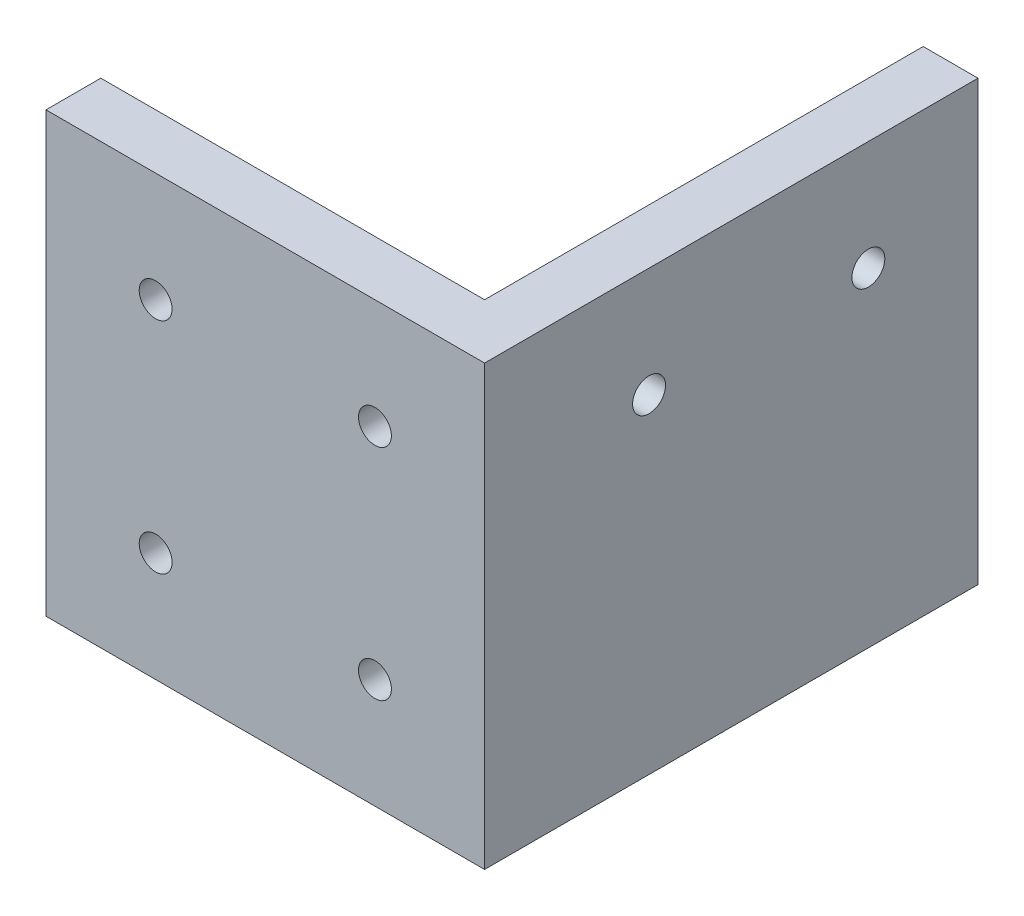
ISO-10303-21;
HEADER;
FILE_DESCRIPTION(('STEP AP214'),'2;1');
FILE_NAME('part.step','',(''),(''),'','','');
FILE_SCHEMA(('AUTOMOTIVE_DESIGN { 1 0 10303 214 1 1 1 1 }'));
ENDSEC;
DATA;
#1=APPLICATION_CONTEXT('core data for automotive mechanical design processes');
#2=APPLICATION_PROTOCOL_DEFINITION('international standard','automotive_design',2000,#1);
#3=PRODUCT_CONTEXT('',#1,'mechanical');
#4=PRODUCT('Part','Part','',(#3));
#5=PRODUCT_RELATED_PRODUCT_CATEGORY('part','',(#4));
#6=PRODUCT_DEFINITION_FORMATION('','',#4);
#7=PRODUCT_DEFINITION_CONTEXT('part definition',#1,'design');
#8=PRODUCT_DEFINITION('design','',#6,#7);
#9=PRODUCT_DEFINITION_SHAPE('','',#8);
#10=(LENGTH_UNIT() NAMED_UNIT(*) SI_UNIT(.MILLI.,.METRE.));
#11=(NAMED_UNIT(*) PLANE_ANGLE_UNIT() SI_UNIT($,.RADIAN.));
#12=(NAMED_UNIT(*) SI_UNIT($,.STERADIAN.) SOLID_ANGLE_UNIT());
#13=UNCERTAINTY_MEASURE_WITH_UNIT(LENGTH_MEASURE(1.E-05),#10,'distance_accuracy_value','');
#14=(GEOMETRIC_REPRESENTATION_CONTEXT(3) GLOBAL_UNCERTAINTY_ASSIGNED_CONTEXT((#13)) GLOBAL_UNIT_ASSIGNED_CONTEXT((#10,
#11,#12)) REPRESENTATION_CONTEXT('',''));
#15=CARTESIAN_POINT('',(0.,0.,0.));
#16=DIRECTION('',(0.,0.,1.));
#17=DIRECTION('',(1.,0.,0.));
#18=AXIS2_PLACEMENT_3D('',#15,#16,#17);
#19=CARTESIAN_POINT('',(0.,85.,-7.));
#20=DIRECTION('',(-1.,0.,0.));
#21=DIRECTION('',(0.,0.,1.));
#22=AXIS2_PLACEMENT_3D('',#19,#20,#21);
#23=CYLINDRICAL_SURFACE('',#22,1.5);
#24=CARTESIAN_POINT('',(0.,85.,-7.));
#25=DIRECTION('',(-1.,0.,0.));
#26=DIRECTION('',(0.,0.,1.));
#27=AXIS2_PLACEMENT_3D('',#24,#25,#26);
#28=CIRCLE('',#27,1.5);
#29=CARTESIAN_POINT('',(0.,85.,-5.5));
#30=VERTEX_POINT('',#29);
#31=EDGE_CURVE('E115',#30,#30,#28,.T.);
#32=ORIENTED_EDGE('',*,*,#31,.F.);
#33=EDGE_LOOP('',(#32));
#34=FACE_BOUND('',#33,.T.);
#35=CARTESIAN_POINT('',(-3.5,85.,-7.));
#36=DIRECTION('',(-1.,0.,0.));
#37=DIRECTION('',(0.,0.,1.));
#38=AXIS2_PLACEMENT_3D('',#35,#36,#37);
#39=CIRCLE('',#38,1.5);
#40=CARTESIAN_POINT('',(-3.5,85.,-5.5));
#41=VERTEX_POINT('',#40);
#42=EDGE_CURVE('E49',#41,#41,#39,.F.);
#43=ORIENTED_EDGE('',*,*,#42,.F.);
#44=EDGE_LOOP('',(#43));
#45=FACE_BOUND('',#44,.T.);
#46=ADVANCED_FACE('F45',(#34,#45),#23,.F.);
#47=CARTESIAN_POINT('',(0.,85.,-27.));
#48=DIRECTION('',(-1.,0.,0.));
#49=DIRECTION('',(0.,0.,1.));
#50=AXIS2_PLACEMENT_3D('',#47,#48,#49);
#51=CYLINDRICAL_SURFACE('',#50,1.5);
#52=CARTESIAN_POINT('',(0.,85.,-27.));
#53=DIRECTION('',(-1.,0.,0.));
#54=DIRECTION('',(0.,0.,1.));
#55=AXIS2_PLACEMENT_3D('',#52,#53,#54);
#56=CIRCLE('',#55,1.5);
#57=CARTESIAN_POINT('',(0.,85.,-25.5));
#58=VERTEX_POINT('',#57);
#59=EDGE_CURVE('E169',#58,#58,#56,.T.);
#60=ORIENTED_EDGE('',*,*,#59,.F.);
#61=EDGE_LOOP('',(#60));
#62=FACE_BOUND('',#61,.T.);
#63=CARTESIAN_POINT('',(-3.5,85.,-27.));
#64=DIRECTION('',(-1.,0.,0.));
#65=DIRECTION('',(0.,0.,1.));
#66=AXIS2_PLACEMENT_3D('',#63,#64,#65);
#67=CIRCLE('',#66,1.5);
#68=CARTESIAN_POINT('',(-3.5,85.,-25.5));
#69=VERTEX_POINT('',#68);
#70=EDGE_CURVE('E163',#69,#69,#67,.F.);
#71=ORIENTED_EDGE('',*,*,#70,.F.);
#72=EDGE_LOOP('',(#71));
#73=FACE_BOUND('',#72,.T.);
#74=ADVANCED_FACE('F224',(#62,#73),#51,.F.);
#75=CARTESIAN_POINT('',(-10.,85.,597.1));
#76=DIRECTION('',(0.,0.,-1.));
#77=DIRECTION('',(0.,1.,0.));
#78=AXIS2_PLACEMENT_3D('',#75,#76,#77);
#79=CYLINDRICAL_SURFACE('',#78,1.5);
#80=CARTESIAN_POINT('',(-10.,85.,3.));
#81=DIRECTION('',(0.,0.,-1.));
#82=DIRECTION('',(0.,1.,0.));
#83=AXIS2_PLACEMENT_3D('',#80,#81,#82);
#84=CIRCLE('',#83,1.5);
#85=CARTESIAN_POINT('',(-10.,86.5,3.));
#86=VERTEX_POINT('',#85);
#87=EDGE_CURVE('E134',#86,#86,#84,.T.);
#88=ORIENTED_EDGE('',*,*,#87,.T.);
#89=EDGE_LOOP('',(#88));
#90=FACE_BOUND('',#89,.T.);
#91=CARTESIAN_POINT('',(-10.,85.,8.00000000000001));
#92=DIRECTION('',(0.,0.,-1.));
#93=DIRECTION('',(0.,1.,0.));
#94=AXIS2_PLACEMENT_3D('',#91,#92,#93);
#95=CIRCLE('',#94,1.5);
#96=CARTESIAN_POINT('',(-10.,86.5,8.00000000000001));
#97=VERTEX_POINT('',#96);
#98=EDGE_CURVE('E139',#97,#97,#95,.T.);
#99=ORIENTED_EDGE('',*,*,#98,.F.);
#100=EDGE_LOOP('',(#99));
#101=FACE_BOUND('',#100,.T.);
#102=ADVANCED_FACE('F231',(#90,#101),#79,.F.);
#103=CARTESIAN_POINT('',(-30.,85.,597.1));
#104=DIRECTION('',(0.,0.,-1.));
#105=DIRECTION('',(0.,1.,0.));
#106=AXIS2_PLACEMENT_3D('',#103,#104,#105);
#107=CYLINDRICAL_SURFACE('',#106,1.5);
#108=CARTESIAN_POINT('',(-30.,85.,3.));
#109=DIRECTION('',(0.,0.,-1.));
#110=DIRECTION('',(0.,1.,0.));
#111=AXIS2_PLACEMENT_3D('',#108,#109,#110);
#112=CIRCLE('',#111,1.5);
#113=CARTESIAN_POINT('',(-30.,86.5,3.));
#114=VERTEX_POINT('',#113);
#115=EDGE_CURVE('E131',#114,#114,#112,.T.);
#116=ORIENTED_EDGE('',*,*,#115,.T.);
#117=EDGE_LOOP('',(#116));
#118=FACE_BOUND('',#117,.T.);
#119=CARTESIAN_POINT('',(-30.,85.,8.00000000000001));
#120=DIRECTION('',(0.,0.,-1.));
#121=DIRECTION('',(0.,1.,0.));
#122=AXIS2_PLACEMENT_3D('',#119,#120,#121);
#123=CIRCLE('',#122,1.5);
#124=CARTESIAN_POINT('',(-30.,86.5,8.00000000000001));
#125=VERTEX_POINT('',#124);
#126=EDGE_CURVE('E142',#125,#125,#123,.T.);
#127=ORIENTED_EDGE('',*,*,#126,.F.);
#128=EDGE_LOOP('',(#127));
#129=FACE_BOUND('',#128,.T.);
#130=ADVANCED_FACE('F246',(#118,#129),#107,.F.);
#131=CARTESIAN_POINT('',(-30.,65.,597.1));
#132=DIRECTION('',(0.,0.,-1.));
#133=DIRECTION('',(0.,1.,0.));
#134=AXIS2_PLACEMENT_3D('',#131,#132,#133);
#135=CYLINDRICAL_SURFACE('',#134,1.50000000000001);
#136=CARTESIAN_POINT('',(-30.,65.,3.));
#137=DIRECTION('',(0.,0.,-1.));
#138=DIRECTION('',(0.,1.,0.));
#139=AXIS2_PLACEMENT_3D('',#136,#137,#138);
#140=CIRCLE('',#139,1.50000000000001);
#141=CARTESIAN_POINT('',(-30.,66.5,3.));
#142=VERTEX_POINT('',#141);
#143=EDGE_CURVE('E125',#142,#142,#140,.T.);
#144=ORIENTED_EDGE('',*,*,#143,.T.);
#145=EDGE_LOOP('',(#144));
#146=FACE_BOUND('',#145,.T.);
#147=CARTESIAN_POINT('',(-30.,65.,8.00000000000001));
#148=DIRECTION('',(0.,0.,-1.));
#149=DIRECTION('',(0.,1.,0.));
#150=AXIS2_PLACEMENT_3D('',#147,#148,#149);
#151=CIRCLE('',#150,1.50000000000001);
#152=CARTESIAN_POINT('',(-30.,66.5,8.00000000000001));
#153=VERTEX_POINT('',#152);
#154=EDGE_CURVE('E145',#153,#153,#151,.T.);
#155=ORIENTED_EDGE('',*,*,#154,.F.);
#156=EDGE_LOOP('',(#155));
#157=FACE_BOUND('',#156,.T.);
#158=ADVANCED_FACE('F219',(#146,#157),#135,.F.);
#159=CARTESIAN_POINT('',(-10.,65.,597.1));
#160=DIRECTION('',(0.,0.,-1.));
#161=DIRECTION('',(0.,1.,0.));
#162=AXIS2_PLACEMENT_3D('',#159,#160,#161);
#163=CYLINDRICAL_SURFACE('',#162,1.5);
#164=CARTESIAN_POINT('',(-10.,65.,3.));
#165=DIRECTION('',(0.,0.,-1.));
#166=DIRECTION('',(0.,1.,0.));
#167=AXIS2_PLACEMENT_3D('',#164,#165,#166);
#168=CIRCLE('',#167,1.5);
#169=CARTESIAN_POINT('',(-10.,66.5,3.));
#170=VERTEX_POINT('',#169);
#171=EDGE_CURVE('E121',#170,#170,#168,.T.);
#172=ORIENTED_EDGE('',*,*,#171,.T.);
#173=EDGE_LOOP('',(#172));
#174=FACE_BOUND('',#173,.T.);
#175=CARTESIAN_POINT('',(-10.,65.,8.00000000000001));
#176=DIRECTION('',(0.,0.,-1.));
#177=DIRECTION('',(0.,1.,0.));
#178=AXIS2_PLACEMENT_3D('',#175,#176,#177);
#179=CIRCLE('',#178,1.5);
#180=CARTESIAN_POINT('',(-10.,66.5,8.00000000000001));
#181=VERTEX_POINT('',#180);
#182=EDGE_CURVE('E148',#181,#181,#179,.T.);
#183=ORIENTED_EDGE('',*,*,#182,.F.);
#184=EDGE_LOOP('',(#183));
#185=FACE_BOUND('',#184,.T.);
#186=ADVANCED_FACE('F211',(#174,#185),#163,.F.);
#187=CARTESIAN_POINT('',(-40.,0.,0.));
#188=DIRECTION('',(-1.,0.,0.));
#189=DIRECTION('',(0.,0.,1.));
#190=AXIS2_PLACEMENT_3D('',#187,#188,#189);
#191=PLANE('',#190);
#192=DIRECTION('',(0.,-1.,0.));
#193=VECTOR('',#192,1.);
#194=CARTESIAN_POINT('',(-40.,95.,3.));
#195=LINE('',#194,#193);
#196=CARTESIAN_POINT('',(-40.,95.,3.));
#197=VERTEX_POINT('',#196);
#198=CARTESIAN_POINT('',(-40.,55.,3.));
#199=VERTEX_POINT('',#198);
#200=EDGE_CURVE('E152',#197,#199,#195,.T.);
#201=ORIENTED_EDGE('',*,*,#200,.T.);
#202=DIRECTION('',(0.,0.,1.));
#203=VECTOR('',#202,1.);
#204=CARTESIAN_POINT('',(-40.,55.,3.));
#205=LINE('',#204,#203);
#206=CARTESIAN_POINT('',(-40.,55.,8.00000000000001));
#207=VERTEX_POINT('',#206);
#208=EDGE_CURVE('E155',#199,#207,#205,.T.);
#209=ORIENTED_EDGE('',*,*,#208,.T.);
#210=DIRECTION('',(0.,1.,0.));
#211=VECTOR('',#210,1.);
#212=CARTESIAN_POINT('',(-40.,95.,8.));
#213=LINE('',#212,#211);
#214=CARTESIAN_POINT('',(-40.,95.,8.));
#215=VERTEX_POINT('',#214);
#216=EDGE_CURVE('E157',#207,#215,#213,.T.);
#217=ORIENTED_EDGE('',*,*,#216,.T.);
#218=DIRECTION('',(0.,0.,-1.));
#219=VECTOR('',#218,1.);
#220=CARTESIAN_POINT('',(-40.,95.,3.));
#221=LINE('',#220,#219);
#222=EDGE_CURVE('E107',#215,#197,#221,.T.);
#223=ORIENTED_EDGE('',*,*,#222,.T.);
#224=EDGE_LOOP('',(#201,#209,#217,#223));
#225=FACE_BOUND('',#224,.T.);
#226=ADVANCED_FACE('F209',(#225),#191,.T.);
#227=CARTESIAN_POINT('',(-40.,95.,8.));
#228=DIRECTION('',(0.,0.,-1.));
#229=DIRECTION('',(0.,1.,0.));
#230=AXIS2_PLACEMENT_3D('',#227,#228,#229);
#231=PLANE('',#230);
#232=ORIENTED_EDGE('',*,*,#182,.T.);
#233=EDGE_LOOP('',(#232));
#234=FACE_BOUND('',#233,.T.);
#235=ORIENTED_EDGE('',*,*,#154,.T.);
#236=EDGE_LOOP('',(#235));
#237=FACE_BOUND('',#236,.T.);
#238=ORIENTED_EDGE('',*,*,#126,.T.);
#239=EDGE_LOOP('',(#238));
#240=FACE_BOUND('',#239,.T.);
#241=ORIENTED_EDGE('',*,*,#98,.T.);
#242=EDGE_LOOP('',(#241));
#243=FACE_BOUND('',#242,.T.);
#244=DIRECTION('',(1.,0.,0.));
#245=VECTOR('',#244,1.);
#246=CARTESIAN_POINT('',(-40.,55.,8.00000000000001));
#247=LINE('',#246,#245);
#248=CARTESIAN_POINT('',(0.,55.,8.00000000000001));
#249=VERTEX_POINT('',#248);
#250=EDGE_CURVE('E54',#207,#249,#247,.T.);
#251=ORIENTED_EDGE('',*,*,#250,.T.);
#252=DIRECTION('',(0.,-1.,0.));
#253=VECTOR('',#252,1.);
#254=CARTESIAN_POINT('',(0.,95.,8.));
#255=LINE('',#254,#253);
#256=CARTESIAN_POINT('',(0.,95.,8.));
#257=VERTEX_POINT('',#256);
#258=EDGE_CURVE('E110',#257,#249,#255,.T.);
#259=ORIENTED_EDGE('',*,*,#258,.F.);
#260=DIRECTION('',(1.,0.,0.));
#261=VECTOR('',#260,1.);
#262=CARTESIAN_POINT('',(-40.,95.,8.));
#263=LINE('',#262,#261);
#264=EDGE_CURVE('E102',#215,#257,#263,.T.);
#265=ORIENTED_EDGE('',*,*,#264,.F.);
#266=ORIENTED_EDGE('',*,*,#216,.F.);
#267=EDGE_LOOP('',(#251,#259,#265,#266));
#268=FACE_BOUND('',#267,.T.);
#269=ADVANCED_FACE('F111',(#234,#237,#240,#243,#268),#231,.F.);
#270=CARTESIAN_POINT('',(-40.,55.,3.));
#271=DIRECTION('',(0.,1.,0.));
#272=DIRECTION('',(0.,0.,1.));
#273=AXIS2_PLACEMENT_3D('',#270,#271,#272);
#274=PLANE('',#273);
#275=DIRECTION('',(0.,0.,1.));
#276=VECTOR('',#275,1.);
#277=CARTESIAN_POINT('',(0.,55.,3.));
#278=LINE('',#277,#276);
#279=CARTESIAN_POINT('',(0.,55.,-37.));
#280=VERTEX_POINT('',#279);
#281=EDGE_CURVE('E151',#280,#249,#278,.T.);
#282=ORIENTED_EDGE('',*,*,#281,.T.);
#283=ORIENTED_EDGE('',*,*,#250,.F.);
#284=ORIENTED_EDGE('',*,*,#208,.F.);
#285=DIRECTION('',(1.,0.,0.));
#286=VECTOR('',#285,1.);
#287=CARTESIAN_POINT('',(-40.,55.,3.));
#288=LINE('',#287,#286);
#289=CARTESIAN_POINT('',(-5.,55.,3.));
#290=VERTEX_POINT('',#289);
#291=EDGE_CURVE('E11',#199,#290,#288,.T.);
#292=ORIENTED_EDGE('',*,*,#291,.T.);
#293=DIRECTION('',(0.,0.,-1.));
#294=VECTOR('',#293,1.);
#295=CARTESIAN_POINT('',(-5.,55.,3.));
#296=LINE('',#295,#294);
#297=CARTESIAN_POINT('',(-5.,55.,-37.));
#298=VERTEX_POINT('',#297);
#299=EDGE_CURVE('E69',#290,#298,#296,.T.);
#300=ORIENTED_EDGE('',*,*,#299,.T.);
#301=DIRECTION('',(1.,0.,0.));
#302=VECTOR('',#301,1.);
#303=CARTESIAN_POINT('',(-5.,55.,-37.));
#304=LINE('',#303,#302);
#305=EDGE_CURVE('E127',#298,#280,#304,.T.);
#306=ORIENTED_EDGE('',*,*,#305,.T.);
#307=EDGE_LOOP('',(#282,#283,#284,#292,#300,#306));
#308=FACE_BOUND('',#307,.T.);
#309=ADVANCED_FACE('F200',(#308),#274,.F.);
#310=CARTESIAN_POINT('',(-40.,95.,3.));
#311=DIRECTION('',(0.,0.,1.));
#312=DIRECTION('',(0.,-1.,0.));
#313=AXIS2_PLACEMENT_3D('',#310,#311,#312);
#314=PLANE('',#313);
#315=ORIENTED_EDGE('',*,*,#171,.F.);
#316=EDGE_LOOP('',(#315));
#317=FACE_BOUND('',#316,.T.);
#318=ORIENTED_EDGE('',*,*,#143,.F.);
#319=EDGE_LOOP('',(#318));
#320=FACE_BOUND('',#319,.T.);
#321=ORIENTED_EDGE('',*,*,#115,.F.);
#322=EDGE_LOOP('',(#321));
#323=FACE_BOUND('',#322,.T.);
#324=ORIENTED_EDGE('',*,*,#87,.F.);
#325=EDGE_LOOP('',(#324));
#326=FACE_BOUND('',#325,.T.);
#327=DIRECTION('',(1.,0.,0.));
#328=VECTOR('',#327,1.);
#329=CARTESIAN_POINT('',(-40.,95.,3.));
#330=LINE('',#329,#328);
#331=CARTESIAN_POINT('',(-5.,95.,3.));
#332=VERTEX_POINT('',#331);
#333=EDGE_CURVE('E108',#197,#332,#330,.T.);
#334=ORIENTED_EDGE('',*,*,#333,.T.);
#335=DIRECTION('',(0.,-1.,0.));
#336=VECTOR('',#335,1.);
#337=CARTESIAN_POINT('',(-5.,95.,3.));
#338=LINE('',#337,#336);
#339=EDGE_CURVE('E188',#332,#290,#338,.T.);
#340=ORIENTED_EDGE('',*,*,#339,.T.);
#341=ORIENTED_EDGE('',*,*,#291,.F.);
#342=ORIENTED_EDGE('',*,*,#200,.F.);
#343=EDGE_LOOP('',(#334,#340,#341,#342));
#344=FACE_BOUND('',#343,.T.);
#345=ADVANCED_FACE('F206',(#317,#320,#323,#326,#344),#314,.F.);
#346=CARTESIAN_POINT('',(0.,95.,597.1));
#347=DIRECTION('',(0.,1.,0.));
#348=DIRECTION('',(0.,0.,1.));
#349=AXIS2_PLACEMENT_3D('',#346,#347,#348);
#350=PLANE('',#349);
#351=ORIENTED_EDGE('',*,*,#264,.T.);
#352=DIRECTION('',(0.,0.,-1.));
#353=VECTOR('',#352,1.);
#354=CARTESIAN_POINT('',(0.,95.,597.1));
#355=LINE('',#354,#353);
#356=CARTESIAN_POINT('',(0.,95.,-37.));
#357=VERTEX_POINT('',#356);
#358=EDGE_CURVE('E104',#257,#357,#355,.T.);
#359=ORIENTED_EDGE('',*,*,#358,.T.);
#360=DIRECTION('',(1.,0.,0.));
#361=VECTOR('',#360,1.);
#362=CARTESIAN_POINT('',(-5.,95.,-37.));
#363=LINE('',#362,#361);
#364=CARTESIAN_POINT('',(-5.,95.,-37.));
#365=VERTEX_POINT('',#364);
#366=EDGE_CURVE('E122',#365,#357,#363,.T.);
#367=ORIENTED_EDGE('',*,*,#366,.F.);
#368=DIRECTION('',(0.,0.,1.));
#369=VECTOR('',#368,1.);
#370=CARTESIAN_POINT('',(-5.,95.,3.));
#371=LINE('',#370,#369);
#372=EDGE_CURVE('E194',#365,#332,#371,.T.);
#373=ORIENTED_EDGE('',*,*,#372,.T.);
#374=ORIENTED_EDGE('',*,*,#333,.F.);
#375=ORIENTED_EDGE('',*,*,#222,.F.);
#376=EDGE_LOOP('',(#351,#359,#367,#373,#374,#375));
#377=FACE_BOUND('',#376,.T.);
#378=ADVANCED_FACE('F47',(#377),#350,.T.);
#379=CARTESIAN_POINT('',(0.,95.,597.1));
#380=DIRECTION('',(-1.,0.,0.));
#381=DIRECTION('',(0.,0.,1.));
#382=AXIS2_PLACEMENT_3D('',#379,#380,#381);
#383=PLANE('',#382);
#384=ORIENTED_EDGE('',*,*,#358,.F.);
#385=ORIENTED_EDGE('',*,*,#258,.T.);
#386=ORIENTED_EDGE('',*,*,#281,.F.);
#387=DIRECTION('',(0.,1.,0.));
#388=VECTOR('',#387,1.);
#389=CARTESIAN_POINT('',(0.,95.,-37.));
#390=LINE('',#389,#388);
#391=EDGE_CURVE('E114',#280,#357,#390,.T.);
#392=ORIENTED_EDGE('',*,*,#391,.T.);
#393=EDGE_LOOP('',(#384,#385,#386,#392));
#394=FACE_BOUND('',#393,.T.);
#395=ORIENTED_EDGE('',*,*,#31,.T.);
#396=EDGE_LOOP('',(#395));
#397=FACE_BOUND('',#396,.T.);
#398=ORIENTED_EDGE('',*,*,#59,.T.);
#399=EDGE_LOOP('',(#398));
#400=FACE_BOUND('',#399,.T.);
#401=ADVANCED_FACE('F118',(#394,#397,#400),#383,.F.);
#402=CARTESIAN_POINT('',(-5.,95.,-37.));
#403=DIRECTION('',(0.,0.,-1.));
#404=DIRECTION('',(0.,1.,0.));
#405=AXIS2_PLACEMENT_3D('',#402,#403,#404);
#406=PLANE('',#405);
#407=ORIENTED_EDGE('',*,*,#391,.F.);
#408=ORIENTED_EDGE('',*,*,#305,.F.);
#409=DIRECTION('',(0.,1.,0.));
#410=VECTOR('',#409,1.);
#411=CARTESIAN_POINT('',(-5.,95.,-37.));
#412=LINE('',#411,#410);
#413=EDGE_CURVE('E191',#298,#365,#412,.T.);
#414=ORIENTED_EDGE('',*,*,#413,.T.);
#415=ORIENTED_EDGE('',*,*,#366,.T.);
#416=EDGE_LOOP('',(#407,#408,#414,#415));
#417=FACE_BOUND('',#416,.T.);
#418=ADVANCED_FACE('F202',(#417),#406,.T.);
#419=CARTESIAN_POINT('',(-5.,0.,0.));
#420=DIRECTION('',(1.,0.,0.));
#421=DIRECTION('',(0.,0.,-1.));
#422=AXIS2_PLACEMENT_3D('',#419,#420,#421);
#423=PLANE('',#422);
#424=CARTESIAN_POINT('',(-5.,85.,-27.));
#425=DIRECTION('',(-1.,0.,0.));
#426=DIRECTION('',(0.,0.,1.));
#427=AXIS2_PLACEMENT_3D('',#424,#425,#426);
#428=CIRCLE('',#427,3.5);
#429=CARTESIAN_POINT('',(-5.,85.,-23.5));
#430=VERTEX_POINT('',#429);
#431=EDGE_CURVE('E171',#430,#430,#428,.T.);
#432=ORIENTED_EDGE('',*,*,#431,.F.);
#433=EDGE_LOOP('',(#432));
#434=FACE_BOUND('',#433,.T.);
#435=CARTESIAN_POINT('',(-5.,85.,-7.));
#436=DIRECTION('',(-1.,0.,0.));
#437=DIRECTION('',(0.,0.,1.));
#438=AXIS2_PLACEMENT_3D('',#435,#436,#437);
#439=CIRCLE('',#438,3.5);
#440=CARTESIAN_POINT('',(-5.,85.,-3.5));
#441=VERTEX_POINT('',#440);
#442=EDGE_CURVE('E176',#441,#441,#439,.T.);
#443=ORIENTED_EDGE('',*,*,#442,.F.);
#444=EDGE_LOOP('',(#443));
#445=FACE_BOUND('',#444,.T.);
#446=ORIENTED_EDGE('',*,*,#339,.F.);
#447=ORIENTED_EDGE('',*,*,#372,.F.);
#448=ORIENTED_EDGE('',*,*,#413,.F.);
#449=ORIENTED_EDGE('',*,*,#299,.F.);
#450=EDGE_LOOP('',(#446,#447,#448,#449));
#451=FACE_BOUND('',#450,.T.);
#452=ADVANCED_FACE('F203',(#434,#445,#451),#423,.F.);
#453=CARTESIAN_POINT('',(-3.5,85.,-27.));
#454=DIRECTION('',(-1.,0.,0.));
#455=DIRECTION('',(0.,0.,1.));
#456=AXIS2_PLACEMENT_3D('',#453,#454,#455);
#457=PLANE('',#456);
#458=CARTESIAN_POINT('',(-3.5,85.,-27.));
#459=DIRECTION('',(-1.,0.,0.));
#460=DIRECTION('',(0.,0.,1.));
#461=AXIS2_PLACEMENT_3D('',#458,#459,#460);
#462=CIRCLE('',#461,3.5);
#463=CARTESIAN_POINT('',(-3.5,85.,-23.5));
#464=VERTEX_POINT('',#463);
#465=EDGE_CURVE('E165',#464,#464,#462,.T.);
#466=ORIENTED_EDGE('',*,*,#465,.T.);
#467=EDGE_LOOP('',(#466));
#468=FACE_BOUND('',#467,.T.);
#469=ORIENTED_EDGE('',*,*,#70,.T.);
#470=EDGE_LOOP('',(#469));
#471=FACE_BOUND('',#470,.T.);
#472=ADVANCED_FACE('F240',(#468,#471),#457,.T.);
#473=CARTESIAN_POINT('',(-3.5,85.,-27.));
#474=DIRECTION('',(-1.,0.,0.));
#475=DIRECTION('',(0.,0.,1.));
#476=AXIS2_PLACEMENT_3D('',#473,#474,#475);
#477=CYLINDRICAL_SURFACE('',#476,3.5);
#478=ORIENTED_EDGE('',*,*,#465,.F.);
#479=EDGE_LOOP('',(#478));
#480=FACE_BOUND('',#479,.T.);
#481=ORIENTED_EDGE('',*,*,#431,.T.);
#482=EDGE_LOOP('',(#481));
#483=FACE_BOUND('',#482,.T.);
#484=ADVANCED_FACE('F447',(#480,#483),#477,.F.);
#485=CARTESIAN_POINT('',(-3.5,85.,-7.));
#486=DIRECTION('',(-1.,0.,0.));
#487=DIRECTION('',(0.,0.,1.));
#488=AXIS2_PLACEMENT_3D('',#485,#486,#487);
#489=PLANE('',#488);
#490=CARTESIAN_POINT('',(-3.5,85.,-7.));
#491=DIRECTION('',(-1.,0.,0.));
#492=DIRECTION('',(0.,0.,1.));
#493=AXIS2_PLACEMENT_3D('',#490,#491,#492);
#494=CIRCLE('',#493,3.5);
#495=CARTESIAN_POINT('',(-3.5,85.,-3.5));
#496=VERTEX_POINT('',#495);
#497=EDGE_CURVE('E181',#496,#496,#494,.T.);
#498=ORIENTED_EDGE('',*,*,#497,.T.);
#499=EDGE_LOOP('',(#498));
#500=FACE_BOUND('',#499,.T.);
#501=ORIENTED_EDGE('',*,*,#42,.T.);
#502=EDGE_LOOP('',(#501));
#503=FACE_BOUND('',#502,.T.);
#504=ADVANCED_FACE('F455',(#500,#503),#489,.T.);
#505=CARTESIAN_POINT('',(-3.5,85.,-7.));
#506=DIRECTION('',(-1.,0.,0.));
#507=DIRECTION('',(0.,0.,1.));
#508=AXIS2_PLACEMENT_3D('',#505,#506,#507);
#509=CYLINDRICAL_SURFACE('',#508,3.5);
#510=ORIENTED_EDGE('',*,*,#497,.F.);
#511=EDGE_LOOP('',(#510));
#512=FACE_BOUND('',#511,.T.);
#513=ORIENTED_EDGE('',*,*,#442,.T.);
#514=EDGE_LOOP('',(#513));
#515=FACE_BOUND('',#514,.T.);
#516=ADVANCED_FACE('F465',(#512,#515),#509,.F.);
#517=CLOSED_SHELL('',(#46,#74,#102,#130,#158,#186,#226,#269,#309,#345,#378,#401,#418,#452,#472,
#484,#504,#516));
#518=MANIFOLD_SOLID_BREP('B2',#517);
#519=ADVANCED_BREP_SHAPE_REPRESENTATION('',(#18,#518),#14);
#520=SHAPE_DEFINITION_REPRESENTATION(#9,#519);
ENDSEC;
END-ISO-10303-21;
